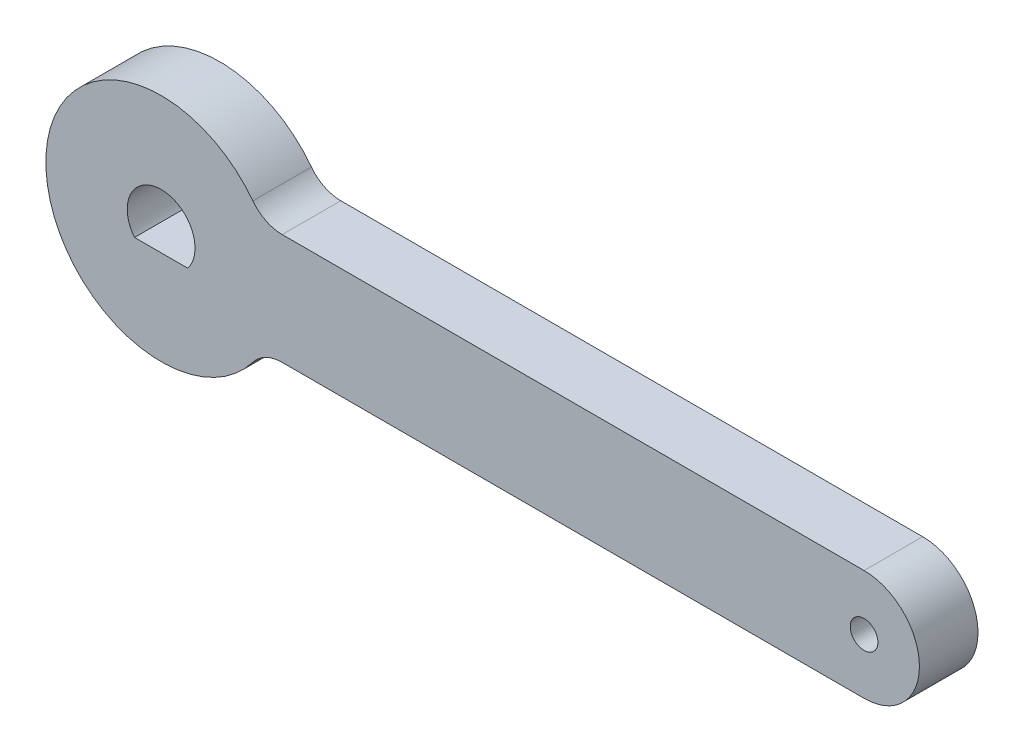
ISO-10303-21;
HEADER;
FILE_DESCRIPTION(('STEP AP214'),'2;1');
FILE_NAME('part.step','',(''),(''),'','','');
FILE_SCHEMA(('AUTOMOTIVE_DESIGN { 1 0 10303 214 1 1 1 1 }'));
ENDSEC;
DATA;
#1=APPLICATION_CONTEXT('core data for automotive mechanical design processes');
#2=APPLICATION_PROTOCOL_DEFINITION('international standard','automotive_design',2000,#1);
#3=PRODUCT_CONTEXT('',#1,'mechanical');
#4=PRODUCT('Part','Part','',(#3));
#5=PRODUCT_RELATED_PRODUCT_CATEGORY('part','',(#4));
#6=PRODUCT_DEFINITION_FORMATION('','',#4);
#7=PRODUCT_DEFINITION_CONTEXT('part definition',#1,'design');
#8=PRODUCT_DEFINITION('design','',#6,#7);
#9=PRODUCT_DEFINITION_SHAPE('','',#8);
#10=(LENGTH_UNIT() NAMED_UNIT(*) SI_UNIT(.MILLI.,.METRE.));
#11=(NAMED_UNIT(*) PLANE_ANGLE_UNIT() SI_UNIT($,.RADIAN.));
#12=(NAMED_UNIT(*) SI_UNIT($,.STERADIAN.) SOLID_ANGLE_UNIT());
#13=UNCERTAINTY_MEASURE_WITH_UNIT(LENGTH_MEASURE(1.E-05),#10,'distance_accuracy_value','');
#14=(GEOMETRIC_REPRESENTATION_CONTEXT(3) GLOBAL_UNCERTAINTY_ASSIGNED_CONTEXT((#13)) GLOBAL_UNIT_ASSIGNED_CONTEXT((#10,
#11,#12)) REPRESENTATION_CONTEXT('',''));
#15=CARTESIAN_POINT('',(0.,0.,0.));
#16=DIRECTION('',(0.,0.,1.));
#17=DIRECTION('',(1.,0.,0.));
#18=AXIS2_PLACEMENT_3D('',#15,#16,#17);
#19=CARTESIAN_POINT('',(0.,-6.,6.35));
#20=DIRECTION('',(0.,1.,0.));
#21=DIRECTION('',(0.,0.,1.));
#22=AXIS2_PLACEMENT_3D('',#19,#20,#21);
#23=PLANE('',#22);
#24=DIRECTION('',(1.,0.,0.));
#25=VECTOR('',#24,1.);
#26=CARTESIAN_POINT('',(0.,-6.,6.35));
#27=LINE('',#26,#25);
#28=CARTESIAN_POINT('',(13.1244047484067,-6.,6.35));
#29=VERTEX_POINT('',#28);
#30=CARTESIAN_POINT('',(76.2,-6.,6.35));
#31=VERTEX_POINT('',#30);
#32=EDGE_CURVE('E150',#29,#31,#27,.T.);
#33=ORIENTED_EDGE('',*,*,#32,.F.);
#34=DIRECTION('',(0.,0.,1.));
#35=VECTOR('',#34,1.);
#36=CARTESIAN_POINT('',(13.1244047484067,-6.,6.35));
#37=LINE('',#36,#35);
#38=CARTESIAN_POINT('',(13.1244047484067,-6.,0.));
#39=VERTEX_POINT('',#38);
#40=EDGE_CURVE('E176',#29,#39,#37,.F.);
#41=ORIENTED_EDGE('',*,*,#40,.T.);
#42=DIRECTION('',(1.,0.,0.));
#43=VECTOR('',#42,1.);
#44=CARTESIAN_POINT('',(0.,-6.,0.));
#45=LINE('',#44,#43);
#46=CARTESIAN_POINT('',(76.2,-6.,0.));
#47=VERTEX_POINT('',#46);
#48=EDGE_CURVE('E146',#39,#47,#45,.T.);
#49=ORIENTED_EDGE('',*,*,#48,.T.);
#50=DIRECTION('',(0.,0.,-1.));
#51=VECTOR('',#50,1.);
#52=CARTESIAN_POINT('',(76.2,-6.,6.35));
#53=LINE('',#52,#51);
#54=EDGE_CURVE('E172',#31,#47,#53,.T.);
#55=ORIENTED_EDGE('',*,*,#54,.F.);
#56=EDGE_LOOP('',(#33,#41,#49,#55));
#57=FACE_BOUND('',#56,.T.);
#58=ADVANCED_FACE('F39',(#57),#23,.F.);
#59=CARTESIAN_POINT('',(76.2,0.,6.35));
#60=DIRECTION('',(0.,0.,-1.));
#61=DIRECTION('',(-1.,0.,0.));
#62=AXIS2_PLACEMENT_3D('',#59,#60,#61);
#63=CYLINDRICAL_SURFACE('',#62,6.);
#64=CARTESIAN_POINT('',(76.2,0.,0.));
#65=DIRECTION('',(0.,0.,1.));
#66=DIRECTION('',(1.,0.,0.));
#67=AXIS2_PLACEMENT_3D('',#64,#65,#66);
#68=CIRCLE('',#67,6.);
#69=CARTESIAN_POINT('',(76.2,6.,0.));
#70=VERTEX_POINT('',#69);
#71=EDGE_CURVE('E164',#47,#70,#68,.T.);
#72=ORIENTED_EDGE('',*,*,#71,.T.);
#73=DIRECTION('',(0.,0.,-1.));
#74=VECTOR('',#73,1.);
#75=CARTESIAN_POINT('',(76.2,6.,6.35));
#76=LINE('',#75,#74);
#77=CARTESIAN_POINT('',(76.2,6.,6.35));
#78=VERTEX_POINT('',#77);
#79=EDGE_CURVE('E161',#78,#70,#76,.T.);
#80=ORIENTED_EDGE('',*,*,#79,.F.);
#81=CARTESIAN_POINT('',(76.2,0.,6.35));
#82=DIRECTION('',(0.,0.,1.));
#83=DIRECTION('',(1.,0.,0.));
#84=AXIS2_PLACEMENT_3D('',#81,#82,#83);
#85=CIRCLE('',#84,6.);
#86=EDGE_CURVE('E153',#31,#78,#85,.T.);
#87=ORIENTED_EDGE('',*,*,#86,.F.);
#88=ORIENTED_EDGE('',*,*,#54,.T.);
#89=EDGE_LOOP('',(#72,#80,#87,#88));
#90=FACE_BOUND('',#89,.T.);
#91=ADVANCED_FACE('F209',(#90),#63,.T.);
#92=CARTESIAN_POINT('',(0.,6.,6.35));
#93=DIRECTION('',(0.,-1.,0.));
#94=DIRECTION('',(0.,0.,-1.));
#95=AXIS2_PLACEMENT_3D('',#92,#93,#94);
#96=PLANE('',#95);
#97=DIRECTION('',(-1.,0.,0.));
#98=VECTOR('',#97,1.);
#99=CARTESIAN_POINT('',(0.,6.,0.));
#100=LINE('',#99,#98);
#101=CARTESIAN_POINT('',(13.1244047484067,6.,0.));
#102=VERTEX_POINT('',#101);
#103=EDGE_CURVE('E154',#70,#102,#100,.T.);
#104=ORIENTED_EDGE('',*,*,#103,.T.);
#105=DIRECTION('',(0.,0.,1.));
#106=VECTOR('',#105,1.);
#107=CARTESIAN_POINT('',(13.1244047484067,6.,6.35));
#108=LINE('',#107,#106);
#109=CARTESIAN_POINT('',(13.1244047484067,6.,6.35));
#110=VERTEX_POINT('',#109);
#111=EDGE_CURVE('E186',#102,#110,#108,.T.);
#112=ORIENTED_EDGE('',*,*,#111,.T.);
#113=DIRECTION('',(-1.,0.,0.));
#114=VECTOR('',#113,1.);
#115=CARTESIAN_POINT('',(0.,6.,6.35));
#116=LINE('',#115,#114);
#117=EDGE_CURVE('E157',#78,#110,#116,.T.);
#118=ORIENTED_EDGE('',*,*,#117,.F.);
#119=ORIENTED_EDGE('',*,*,#79,.T.);
#120=EDGE_LOOP('',(#104,#112,#118,#119));
#121=FACE_BOUND('',#120,.T.);
#122=ADVANCED_FACE('F204',(#121),#96,.F.);
#123=CARTESIAN_POINT('',(0.,0.,6.35));
#124=DIRECTION('',(0.,0.,1.));
#125=DIRECTION('',(1.,0.,0.));
#126=AXIS2_PLACEMENT_3D('',#123,#124,#125);
#127=PLANE('',#126);
#128=CARTESIAN_POINT('',(76.2,0.,6.35));
#129=DIRECTION('',(0.,0.,1.));
#130=DIRECTION('',(1.,0.,0.));
#131=AXIS2_PLACEMENT_3D('',#128,#129,#130);
#132=CIRCLE('',#131,1.5);
#133=CARTESIAN_POINT('',(77.7,0.,6.35));
#134=VERTEX_POINT('',#133);
#135=EDGE_CURVE('E134',#134,#134,#132,.T.);
#136=ORIENTED_EDGE('',*,*,#135,.F.);
#137=EDGE_LOOP('',(#136));
#138=FACE_BOUND('',#137,.T.);
#139=CARTESIAN_POINT('',(0.,0.,6.35));
#140=DIRECTION('',(0.,0.,1.));
#141=DIRECTION('',(1.,0.,0.));
#142=AXIS2_PLACEMENT_3D('',#139,#140,#141);
#143=CIRCLE('',#142,3.675);
#144=CARTESIAN_POINT('',(2.88617393793236,-2.275,6.35));
#145=VERTEX_POINT('',#144);
#146=CARTESIAN_POINT('',(-2.88617393793236,-2.275,6.35));
#147=VERTEX_POINT('',#146);
#148=EDGE_CURVE('E111',#145,#147,#143,.T.);
#149=ORIENTED_EDGE('',*,*,#148,.F.);
#150=DIRECTION('',(1.,0.,0.));
#151=VECTOR('',#150,1.);
#152=CARTESIAN_POINT('',(-2.88617393793236,-2.275,6.35));
#153=LINE('',#152,#151);
#154=EDGE_CURVE('E117',#147,#145,#153,.T.);
#155=ORIENTED_EDGE('',*,*,#154,.F.);
#156=EDGE_LOOP('',(#149,#155));
#157=FACE_BOUND('',#156,.T.);
#158=ORIENTED_EDGE('',*,*,#117,.T.);
#159=CARTESIAN_POINT('',(13.1244047484067,10.,6.35));
#160=DIRECTION('',(0.,0.,1.));
#161=DIRECTION('',(1.,0.,0.));
#162=AXIS2_PLACEMENT_3D('',#159,#160,#161);
#163=CIRCLE('',#162,4.);
#164=CARTESIAN_POINT('',(9.94273087000507,7.57575757575758,6.35));
#165=VERTEX_POINT('',#164);
#166=EDGE_CURVE('E48',#110,#165,#163,.F.);
#167=ORIENTED_EDGE('',*,*,#166,.T.);
#168=CARTESIAN_POINT('',(0.,0.,6.35));
#169=DIRECTION('',(0.,0.,1.));
#170=DIRECTION('',(1.,0.,0.));
#171=AXIS2_PLACEMENT_3D('',#168,#169,#170);
#172=CIRCLE('',#171,12.5);
#173=CARTESIAN_POINT('',(9.94273087000507,-7.57575757575758,6.35));
#174=VERTEX_POINT('',#173);
#175=EDGE_CURVE('E124',#165,#174,#172,.T.);
#176=ORIENTED_EDGE('',*,*,#175,.T.);
#177=CARTESIAN_POINT('',(13.1244047484067,-10.,6.35));
#178=DIRECTION('',(0.,0.,1.));
#179=DIRECTION('',(1.,0.,0.));
#180=AXIS2_PLACEMENT_3D('',#177,#178,#179);
#181=CIRCLE('',#180,4.);
#182=EDGE_CURVE('E192',#174,#29,#181,.F.);
#183=ORIENTED_EDGE('',*,*,#182,.T.);
#184=ORIENTED_EDGE('',*,*,#32,.T.);
#185=ORIENTED_EDGE('',*,*,#86,.T.);
#186=EDGE_LOOP('',(#158,#167,#176,#183,#184,#185));
#187=FACE_BOUND('',#186,.T.);
#188=ADVANCED_FACE('F197',(#138,#157,#187),#127,.T.);
#189=CARTESIAN_POINT('',(0.,0.,0.));
#190=DIRECTION('',(0.,0.,1.));
#191=DIRECTION('',(1.,0.,0.));
#192=AXIS2_PLACEMENT_3D('',#189,#190,#191);
#193=PLANE('',#192);
#194=CARTESIAN_POINT('',(76.2,0.,0.));
#195=DIRECTION('',(0.,0.,1.));
#196=DIRECTION('',(1.,0.,0.));
#197=AXIS2_PLACEMENT_3D('',#194,#195,#196);
#198=CIRCLE('',#197,1.5);
#199=CARTESIAN_POINT('',(77.7,0.,0.));
#200=VERTEX_POINT('',#199);
#201=EDGE_CURVE('E128',#200,#200,#198,.T.);
#202=ORIENTED_EDGE('',*,*,#201,.T.);
#203=EDGE_LOOP('',(#202));
#204=FACE_BOUND('',#203,.T.);
#205=DIRECTION('',(-1.,0.,0.));
#206=VECTOR('',#205,1.);
#207=CARTESIAN_POINT('',(-2.88617393793236,-2.275,0.));
#208=LINE('',#207,#206);
#209=CARTESIAN_POINT('',(2.88617393793236,-2.275,0.));
#210=VERTEX_POINT('',#209);
#211=CARTESIAN_POINT('',(-2.88617393793236,-2.275,0.));
#212=VERTEX_POINT('',#211);
#213=EDGE_CURVE('E120',#210,#212,#208,.T.);
#214=ORIENTED_EDGE('',*,*,#213,.F.);
#215=CARTESIAN_POINT('',(0.,0.,0.));
#216=DIRECTION('',(0.,0.,1.));
#217=DIRECTION('',(1.,0.,0.));
#218=AXIS2_PLACEMENT_3D('',#215,#216,#217);
#219=CIRCLE('',#218,3.675);
#220=EDGE_CURVE('E108',#212,#210,#219,.F.);
#221=ORIENTED_EDGE('',*,*,#220,.F.);
#222=EDGE_LOOP('',(#214,#221));
#223=FACE_BOUND('',#222,.T.);
#224=ORIENTED_EDGE('',*,*,#48,.F.);
#225=CARTESIAN_POINT('',(13.1244047484067,-10.,0.));
#226=DIRECTION('',(0.,0.,1.));
#227=DIRECTION('',(1.,0.,0.));
#228=AXIS2_PLACEMENT_3D('',#225,#226,#227);
#229=CIRCLE('',#228,4.);
#230=CARTESIAN_POINT('',(9.94273087000507,-7.57575757575758,0.));
#231=VERTEX_POINT('',#230);
#232=EDGE_CURVE('E189',#39,#231,#229,.T.);
#233=ORIENTED_EDGE('',*,*,#232,.T.);
#234=CARTESIAN_POINT('',(0.,0.,0.));
#235=DIRECTION('',(0.,0.,1.));
#236=DIRECTION('',(1.,0.,0.));
#237=AXIS2_PLACEMENT_3D('',#234,#235,#236);
#238=CIRCLE('',#237,12.5);
#239=CARTESIAN_POINT('',(9.94273087000507,7.57575757575758,0.));
#240=VERTEX_POINT('',#239);
#241=EDGE_CURVE('E142',#240,#231,#238,.T.);
#242=ORIENTED_EDGE('',*,*,#241,.F.);
#243=CARTESIAN_POINT('',(13.1244047484067,10.,0.));
#244=DIRECTION('',(0.,0.,1.));
#245=DIRECTION('',(1.,0.,0.));
#246=AXIS2_PLACEMENT_3D('',#243,#244,#245);
#247=CIRCLE('',#246,4.);
#248=EDGE_CURVE('E11',#240,#102,#247,.T.);
#249=ORIENTED_EDGE('',*,*,#248,.T.);
#250=ORIENTED_EDGE('',*,*,#103,.F.);
#251=ORIENTED_EDGE('',*,*,#71,.F.);
#252=EDGE_LOOP('',(#224,#233,#242,#249,#250,#251));
#253=FACE_BOUND('',#252,.T.);
#254=ADVANCED_FACE('F126',(#204,#223,#253),#193,.F.);
#255=CARTESIAN_POINT('',(0.,0.,0.));
#256=DIRECTION('',(0.,0.,1.));
#257=DIRECTION('',(1.,0.,0.));
#258=AXIS2_PLACEMENT_3D('',#255,#256,#257);
#259=CYLINDRICAL_SURFACE('',#258,12.5);
#260=ORIENTED_EDGE('',*,*,#241,.T.);
#261=DIRECTION('',(0.,0.,1.));
#262=VECTOR('',#261,1.);
#263=CARTESIAN_POINT('',(9.94273087000507,-7.57575757575758,0.));
#264=LINE('',#263,#262);
#265=EDGE_CURVE('E183',#231,#174,#264,.T.);
#266=ORIENTED_EDGE('',*,*,#265,.T.);
#267=ORIENTED_EDGE('',*,*,#175,.F.);
#268=DIRECTION('',(0.,0.,1.));
#269=VECTOR('',#268,1.);
#270=CARTESIAN_POINT('',(9.94273087000507,7.57575757575758,0.));
#271=LINE('',#270,#269);
#272=EDGE_CURVE('E180',#165,#240,#271,.F.);
#273=ORIENTED_EDGE('',*,*,#272,.T.);
#274=EDGE_LOOP('',(#260,#266,#267,#273));
#275=FACE_BOUND('',#274,.T.);
#276=ADVANCED_FACE('F201',(#275),#259,.T.);
#277=CARTESIAN_POINT('',(0.,0.,-0.00100000000000013));
#278=DIRECTION('',(0.,0.,1.));
#279=DIRECTION('',(1.,0.,0.));
#280=AXIS2_PLACEMENT_3D('',#277,#278,#279);
#281=CYLINDRICAL_SURFACE('',#280,3.675);
#282=ORIENTED_EDGE('',*,*,#220,.T.);
#283=DIRECTION('',(0.,0.,1.));
#284=VECTOR('',#283,1.);
#285=CARTESIAN_POINT('',(2.88617393793236,-2.275,-0.00100000000000013));
#286=LINE('',#285,#284);
#287=EDGE_CURVE('E116',#210,#145,#286,.T.);
#288=ORIENTED_EDGE('',*,*,#287,.T.);
#289=ORIENTED_EDGE('',*,*,#148,.T.);
#290=DIRECTION('',(0.,0.,1.));
#291=VECTOR('',#290,1.);
#292=CARTESIAN_POINT('',(-2.88617393793236,-2.275,-0.00100000000000013));
#293=LINE('',#292,#291);
#294=EDGE_CURVE('E104',#212,#147,#293,.T.);
#295=ORIENTED_EDGE('',*,*,#294,.F.);
#296=EDGE_LOOP('',(#282,#288,#289,#295));
#297=FACE_BOUND('',#296,.T.);
#298=ADVANCED_FACE('F106',(#297),#281,.F.);
#299=CARTESIAN_POINT('',(-2.88617393793236,-2.275,-0.00100000000000013));
#300=DIRECTION('',(0.,-1.,0.));
#301=DIRECTION('',(0.,0.,-1.));
#302=AXIS2_PLACEMENT_3D('',#299,#300,#301);
#303=PLANE('',#302);
#304=ORIENTED_EDGE('',*,*,#213,.T.);
#305=ORIENTED_EDGE('',*,*,#294,.T.);
#306=ORIENTED_EDGE('',*,*,#154,.T.);
#307=ORIENTED_EDGE('',*,*,#287,.F.);
#308=EDGE_LOOP('',(#304,#305,#306,#307));
#309=FACE_BOUND('',#308,.T.);
#310=ADVANCED_FACE('F121',(#309),#303,.F.);
#311=CARTESIAN_POINT('',(76.2,0.,0.));
#312=DIRECTION('',(0.,0.,1.));
#313=DIRECTION('',(1.,0.,0.));
#314=AXIS2_PLACEMENT_3D('',#311,#312,#313);
#315=CYLINDRICAL_SURFACE('',#314,1.5);
#316=ORIENTED_EDGE('',*,*,#201,.F.);
#317=EDGE_LOOP('',(#316));
#318=FACE_BOUND('',#317,.T.);
#319=ORIENTED_EDGE('',*,*,#135,.T.);
#320=EDGE_LOOP('',(#319));
#321=FACE_BOUND('',#320,.T.);
#322=ADVANCED_FACE('F218',(#318,#321),#315,.F.);
#323=CARTESIAN_POINT('',(13.1244047484067,-10.,0.));
#324=DIRECTION('',(0.,0.,1.));
#325=DIRECTION('',(1.,0.,0.));
#326=AXIS2_PLACEMENT_3D('',#323,#324,#325);
#327=CYLINDRICAL_SURFACE('',#326,4.);
#328=ORIENTED_EDGE('',*,*,#182,.F.);
#329=ORIENTED_EDGE('',*,*,#265,.F.);
#330=ORIENTED_EDGE('',*,*,#232,.F.);
#331=ORIENTED_EDGE('',*,*,#40,.F.);
#332=EDGE_LOOP('',(#328,#329,#330,#331));
#333=FACE_BOUND('',#332,.T.);
#334=ADVANCED_FACE('F216',(#333),#327,.F.);
#335=CARTESIAN_POINT('',(13.1244047484067,10.,0.));
#336=DIRECTION('',(0.,0.,1.));
#337=DIRECTION('',(1.,0.,0.));
#338=AXIS2_PLACEMENT_3D('',#335,#336,#337);
#339=CYLINDRICAL_SURFACE('',#338,4.);
#340=ORIENTED_EDGE('',*,*,#248,.F.);
#341=ORIENTED_EDGE('',*,*,#272,.F.);
#342=ORIENTED_EDGE('',*,*,#166,.F.);
#343=ORIENTED_EDGE('',*,*,#111,.F.);
#344=EDGE_LOOP('',(#340,#341,#342,#343));
#345=FACE_BOUND('',#344,.T.);
#346=ADVANCED_FACE('F41',(#345),#339,.F.);
#347=CLOSED_SHELL('',(#58,#91,#122,#188,#254,#276,#298,#310,#322,#334,#346));
#348=MANIFOLD_SOLID_BREP('B2',#347);
#349=ADVANCED_BREP_SHAPE_REPRESENTATION('',(#18,#348),#14);
#350=SHAPE_DEFINITION_REPRESENTATION(#9,#349);
ENDSEC;
END-ISO-10303-21;
